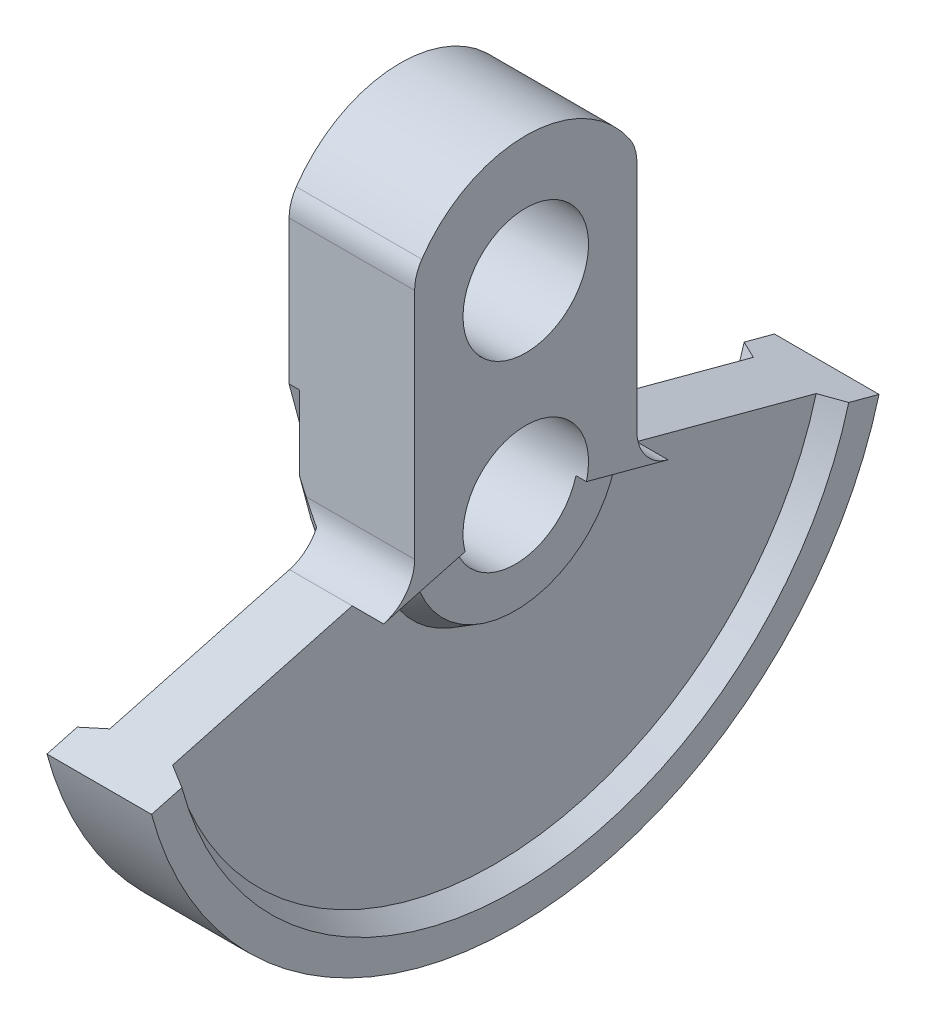
ISO-10303-21;
HEADER;
FILE_DESCRIPTION(('STEP AP214'),'2;1');
FILE_NAME('part.step','',(''),(''),'','','');
FILE_SCHEMA(('AUTOMOTIVE_DESIGN { 1 0 10303 214 1 1 1 1 }'));
ENDSEC;
DATA;
#1=APPLICATION_CONTEXT('core data for automotive mechanical design processes');
#2=APPLICATION_PROTOCOL_DEFINITION('international standard','automotive_design',2000,#1);
#3=PRODUCT_CONTEXT('',#1,'mechanical');
#4=PRODUCT('Part','Part','',(#3));
#5=PRODUCT_RELATED_PRODUCT_CATEGORY('part','',(#4));
#6=PRODUCT_DEFINITION_FORMATION('','',#4);
#7=PRODUCT_DEFINITION_CONTEXT('part definition',#1,'design');
#8=PRODUCT_DEFINITION('design','',#6,#7);
#9=PRODUCT_DEFINITION_SHAPE('','',#8);
#10=(LENGTH_UNIT() NAMED_UNIT(*) SI_UNIT(.MILLI.,.METRE.));
#11=(NAMED_UNIT(*) PLANE_ANGLE_UNIT() SI_UNIT($,.RADIAN.));
#12=(NAMED_UNIT(*) SI_UNIT($,.STERADIAN.) SOLID_ANGLE_UNIT());
#13=UNCERTAINTY_MEASURE_WITH_UNIT(LENGTH_MEASURE(1.E-05),#10,'distance_accuracy_value','');
#14=(GEOMETRIC_REPRESENTATION_CONTEXT(3) GLOBAL_UNCERTAINTY_ASSIGNED_CONTEXT((#13)) GLOBAL_UNIT_ASSIGNED_CONTEXT((#10,
#11,#12)) REPRESENTATION_CONTEXT('',''));
#15=CARTESIAN_POINT('',(0.,0.,0.));
#16=DIRECTION('',(0.,0.,1.));
#17=DIRECTION('',(1.,0.,0.));
#18=AXIS2_PLACEMENT_3D('',#15,#16,#17);
#19=CARTESIAN_POINT('',(0.,0.,0.));
#20=DIRECTION('',(0.,0.965925826289069,-0.258819045102518));
#21=DIRECTION('',(-1.,0.,0.));
#22=AXIS2_PLACEMENT_3D('',#19,#20,#21);
#23=PLANE('',#22);
#24=DIRECTION('',(0.,-0.258819045102518,-0.965925826289069));
#25=VECTOR('',#24,1.);
#26=CARTESIAN_POINT('',(-3.,-8.24216999766041,-30.7601971958889));
#27=LINE('',#26,#25);
#28=CARTESIAN_POINT('',(-3.,-3.64140484936813,-13.5899079087697));
#29=VERTEX_POINT('',#28);
#30=CARTESIAN_POINT('',(-3.,-8.24216999766041,-30.7601971958889));
#31=VERTEX_POINT('',#30);
#32=EDGE_CURVE('E310',#29,#31,#27,.T.);
#33=ORIENTED_EDGE('',*,*,#32,.F.);
#34=DIRECTION('',(-1.,0.,0.));
#35=VECTOR('',#34,1.);
#36=CARTESIAN_POINT('',(6.,-3.64140484936812,-13.5899079087697));
#37=LINE('',#36,#35);
#38=CARTESIAN_POINT('',(3.,-3.64140484936813,-13.5899079087697));
#39=VERTEX_POINT('',#38);
#40=EDGE_CURVE('E291',#29,#39,#37,.F.);
#41=ORIENTED_EDGE('',*,*,#40,.T.);
#42=DIRECTION('',(0.,0.258819045102518,0.965925826289069));
#43=VECTOR('',#42,1.);
#44=CARTESIAN_POINT('',(3.,-2.8470094961277,-10.6251840891798));
#45=LINE('',#44,#43);
#46=CARTESIAN_POINT('',(3.,-8.24216999766041,-30.7601971958889));
#47=VERTEX_POINT('',#46);
#48=EDGE_CURVE('E342',#47,#39,#45,.T.);
#49=ORIENTED_EDGE('',*,*,#48,.F.);
#50=DIRECTION('',(-0.86602540378444,0.129409522551258,0.482962913144531));
#51=VECTOR('',#50,1.);
#52=CARTESIAN_POINT('',(3.,-8.24216999766041,-30.7601971958889));
#53=LINE('',#52,#51);
#54=CARTESIAN_POINT('',(5.,-8.54102848838309,-31.8755522675393));
#55=VERTEX_POINT('',#54);
#56=EDGE_CURVE('E338',#55,#47,#53,.T.);
#57=ORIENTED_EDGE('',*,*,#56,.F.);
#58=DIRECTION('',(0.,0.258819045102518,0.965925826289069));
#59=VECTOR('',#58,1.);
#60=CARTESIAN_POINT('',(5.,-8.54102848838309,-31.8755522675393));
#61=LINE('',#60,#59);
#62=CARTESIAN_POINT('',(5.,-9.31748562369064,-34.7733297464065));
#63=VERTEX_POINT('',#62);
#64=EDGE_CURVE('E335',#63,#55,#61,.T.);
#65=ORIENTED_EDGE('',*,*,#64,.F.);
#66=DIRECTION('',(1.,0.,0.));
#67=VECTOR('',#66,1.);
#68=CARTESIAN_POINT('',(5.,-9.31748562369064,-34.7733297464065));
#69=LINE('',#68,#67);
#70=CARTESIAN_POINT('',(-5.,-9.31748562369064,-34.7733297464065));
#71=VERTEX_POINT('',#70);
#72=EDGE_CURVE('E329',#71,#63,#69,.T.);
#73=ORIENTED_EDGE('',*,*,#72,.F.);
#74=DIRECTION('',(0.,-0.258819045102518,-0.965925826289069));
#75=VECTOR('',#74,1.);
#76=CARTESIAN_POINT('',(-5.,-9.31748562369064,-34.7733297464065));
#77=LINE('',#76,#75);
#78=CARTESIAN_POINT('',(-5.,-8.54102848838309,-31.8755522675393));
#79=VERTEX_POINT('',#78);
#80=EDGE_CURVE('E327',#79,#71,#77,.T.);
#81=ORIENTED_EDGE('',*,*,#80,.F.);
#82=DIRECTION('',(-0.86602540378444,-0.129409522551258,-0.482962913144533));
#83=VECTOR('',#82,1.);
#84=CARTESIAN_POINT('',(-5.,-8.54102848838309,-31.8755522675393));
#85=LINE('',#84,#83);
#86=EDGE_CURVE('E316',#31,#79,#85,.T.);
#87=ORIENTED_EDGE('',*,*,#86,.F.);
#88=EDGE_LOOP('',(#33,#41,#49,#57,#65,#73,#81,#87));
#89=FACE_BOUND('',#88,.T.);
#90=ADVANCED_FACE('F39',(#89),#23,.T.);
#91=CARTESIAN_POINT('',(0.,0.,0.));
#92=DIRECTION('',(-1.,0.,0.));
#93=DIRECTION('',(0.,0.,1.));
#94=AXIS2_PLACEMENT_3D('',#91,#92,#93);
#95=CYLINDRICAL_SURFACE('',#94,8.);
#96=CARTESIAN_POINT('',(-6.,0.,0.));
#97=DIRECTION('',(-1.,0.,0.));
#98=DIRECTION('',(0.,0.,1.));
#99=AXIS2_PLACEMENT_3D('',#96,#97,#98);
#100=CIRCLE('',#99,8.);
#101=CARTESIAN_POINT('',(-6.,-2.07055236082014,-7.72740661031255));
#102=VERTEX_POINT('',#101);
#103=CARTESIAN_POINT('',(-6.,-2.07055236082015,7.72740661031255));
#104=VERTEX_POINT('',#103);
#105=EDGE_CURVE('E286',#102,#104,#100,.T.);
#106=ORIENTED_EDGE('',*,*,#105,.F.);
#107=DIRECTION('',(1.,0.,0.));
#108=VECTOR('',#107,1.);
#109=CARTESIAN_POINT('',(-5.,-2.07055236082014,-7.72740661031255));
#110=LINE('',#109,#108);
#111=CARTESIAN_POINT('',(-5.,-2.07055236082014,-7.72740661031255));
#112=VERTEX_POINT('',#111);
#113=EDGE_CURVE('E250',#102,#112,#110,.T.);
#114=ORIENTED_EDGE('',*,*,#113,.T.);
#115=CARTESIAN_POINT('',(-5.,0.,0.));
#116=DIRECTION('',(-1.,0.,0.));
#117=DIRECTION('',(0.,0.,1.));
#118=AXIS2_PLACEMENT_3D('',#115,#116,#117);
#119=CIRCLE('',#118,8.);
#120=CARTESIAN_POINT('',(-5.,-2.07055236082015,7.72740661031255));
#121=VERTEX_POINT('',#120);
#122=EDGE_CURVE('E229',#112,#121,#119,.T.);
#123=ORIENTED_EDGE('',*,*,#122,.T.);
#124=DIRECTION('',(1.,0.,0.));
#125=VECTOR('',#124,1.);
#126=CARTESIAN_POINT('',(-5.,-2.07055236082014,7.72740661031255));
#127=LINE('',#126,#125);
#128=EDGE_CURVE('E240',#104,#121,#127,.T.);
#129=ORIENTED_EDGE('',*,*,#128,.F.);
#130=EDGE_LOOP('',(#106,#114,#123,#129));
#131=FACE_BOUND('',#130,.T.);
#132=ADVANCED_FACE('F249',(#131),#95,.T.);
#133=CARTESIAN_POINT('',(-6.,-2.07055236082014,-7.72740661031255));
#134=DIRECTION('',(-1.,0.,0.));
#135=DIRECTION('',(0.,0.,1.));
#136=AXIS2_PLACEMENT_3D('',#133,#134,#135);
#137=PLANE('',#136);
#138=DIRECTION('',(0.,-0.965925826289069,-0.258819045102518));
#139=VECTOR('',#138,1.);
#140=CARTESIAN_POINT('',(-6.,18.2138899912503,13.1626065574654));
#141=LINE('',#140,#139);
#142=CARTESIAN_POINT('',(-6.,8.74410041934107,10.6251840891797));
#143=VERTEX_POINT('',#142);
#144=EDGE_CURVE('E237',#143,#104,#141,.T.);
#145=ORIENTED_EDGE('',*,*,#144,.F.);
#146=DIRECTION('',(0.,1.,0.));
#147=VECTOR('',#146,1.);
#148=CARTESIAN_POINT('',(-6.,0.,10.6251840891797));
#149=LINE('',#148,#147);
#150=CARTESIAN_POINT('',(-6.,22.4840758004833,10.6251840891797));
#151=VERTEX_POINT('',#150);
#152=EDGE_CURVE('E453',#143,#151,#149,.T.);
#153=ORIENTED_EDGE('',*,*,#152,.T.);
#154=CARTESIAN_POINT('',(-6.,22.4840758004831,6.62518408917976));
#155=DIRECTION('',(-1.,0.,0.));
#156=DIRECTION('',(0.,0.,1.));
#157=AXIS2_PLACEMENT_3D('',#154,#155,#156);
#158=CIRCLE('',#157,3.99999999999996);
#159=CARTESIAN_POINT('',(-6.,24.7261137007247,9.93777613376963));
#160=VERTEX_POINT('',#159);
#161=EDGE_CURVE('E455',#160,#151,#158,.F.);
#162=ORIENTED_EDGE('',*,*,#161,.F.);
#163=CARTESIAN_POINT('',(-6.,18.,0.));
#164=DIRECTION('',(-1.,0.,0.));
#165=DIRECTION('',(0.,0.,1.));
#166=AXIS2_PLACEMENT_3D('',#163,#164,#165);
#167=CIRCLE('',#166,11.9999999999999);
#168=CARTESIAN_POINT('',(-6.,24.7261137007247,-9.9377761337697));
#169=VERTEX_POINT('',#168);
#170=EDGE_CURVE('E458',#160,#169,#167,.T.);
#171=ORIENTED_EDGE('',*,*,#170,.T.);
#172=CARTESIAN_POINT('',(-6.,22.4840758004831,-6.62518408917976));
#173=DIRECTION('',(-1.,0.,0.));
#174=DIRECTION('',(0.,0.,1.));
#175=AXIS2_PLACEMENT_3D('',#172,#173,#174);
#176=CIRCLE('',#175,4.00000000000004);
#177=CARTESIAN_POINT('',(-6.,22.4840758004832,-10.6251840891798));
#178=VERTEX_POINT('',#177);
#179=EDGE_CURVE('E424',#178,#169,#176,.F.);
#180=ORIENTED_EDGE('',*,*,#179,.F.);
#181=DIRECTION('',(0.,1.,0.));
#182=VECTOR('',#181,1.);
#183=CARTESIAN_POINT('',(-6.,0.,-10.6251840891798));
#184=LINE('',#183,#182);
#185=CARTESIAN_POINT('',(-6.,7.50575230797311,-10.6251840891798));
#186=VERTEX_POINT('',#185);
#187=EDGE_CURVE('E451',#186,#178,#184,.T.);
#188=ORIENTED_EDGE('',*,*,#187,.F.);
#189=DIRECTION('',(0.,-0.258819045102518,-0.965925826289069));
#190=VECTOR('',#189,1.);
#191=CARTESIAN_POINT('',(-6.,7.58870590207055,-10.3155970613377));
#192=LINE('',#191,#190);
#193=CARTESIAN_POINT('',(-6.,7.58870590207055,-10.3155970613377));
#194=VERTEX_POINT('',#193);
#195=EDGE_CURVE('E510',#194,#186,#192,.T.);
#196=ORIENTED_EDGE('',*,*,#195,.F.);
#197=DIRECTION('',(0.,-0.965925826289069,0.258819045102518));
#198=VECTOR('',#197,1.);
#199=CARTESIAN_POINT('',(-6.,7.58870590207055,-10.3155970613377));
#200=LINE('',#199,#198);
#201=EDGE_CURVE('E412',#194,#102,#200,.T.);
#202=ORIENTED_EDGE('',*,*,#201,.T.);
#203=ORIENTED_EDGE('',*,*,#105,.T.);
#204=EDGE_LOOP('',(#145,#153,#162,#171,#180,#188,#196,#202,#203));
#205=FACE_BOUND('',#204,.T.);
#206=CARTESIAN_POINT('',(-6.,0.,0.));
#207=DIRECTION('',(-1.,0.,0.));
#208=DIRECTION('',(0.,0.,1.));
#209=AXIS2_PLACEMENT_3D('',#206,#207,#208);
#210=CIRCLE('',#209,6.);
#211=CARTESIAN_POINT('',(-6.,0.,6.));
#212=VERTEX_POINT('',#211);
#213=EDGE_CURVE('E283',#212,#212,#210,.T.);
#214=ORIENTED_EDGE('',*,*,#213,.F.);
#215=EDGE_LOOP('',(#214));
#216=FACE_BOUND('',#215,.T.);
#217=CARTESIAN_POINT('',(-6.,18.,0.));
#218=DIRECTION('',(-1.,0.,0.));
#219=DIRECTION('',(0.,0.,1.));
#220=AXIS2_PLACEMENT_3D('',#217,#218,#219);
#221=CIRCLE('',#220,6.);
#222=CARTESIAN_POINT('',(-6.,18.,5.99999999999994));
#223=VERTEX_POINT('',#222);
#224=EDGE_CURVE('E414',#223,#223,#221,.T.);
#225=ORIENTED_EDGE('',*,*,#224,.F.);
#226=EDGE_LOOP('',(#225));
#227=FACE_BOUND('',#226,.T.);
#228=ADVANCED_FACE('F41',(#205,#216,#227),#137,.T.);
#229=CARTESIAN_POINT('',(0.,0.,0.));
#230=DIRECTION('',(-1.,0.,0.));
#231=DIRECTION('',(0.,0.,1.));
#232=AXIS2_PLACEMENT_3D('',#229,#230,#231);
#233=CYLINDRICAL_SURFACE('',#232,6.);
#234=ORIENTED_EDGE('',*,*,#213,.T.);
#235=EDGE_LOOP('',(#234));
#236=FACE_BOUND('',#235,.T.);
#237=CARTESIAN_POINT('',(4.99999999999999,0.,0.));
#238=DIRECTION('',(-1.,0.,0.));
#239=DIRECTION('',(0.,0.,1.));
#240=AXIS2_PLACEMENT_3D('',#237,#238,#239);
#241=CIRCLE('',#240,6.);
#242=CARTESIAN_POINT('',(5.,-1.55291427061511,-5.79555495773441));
#243=VERTEX_POINT('',#242);
#244=CARTESIAN_POINT('',(4.99999999999999,-1.55291427061511,5.79555495773441));
#245=VERTEX_POINT('',#244);
#246=EDGE_CURVE('E281',#243,#245,#241,.T.);
#247=ORIENTED_EDGE('',*,*,#246,.F.);
#248=DIRECTION('',(-1.,0.,0.));
#249=VECTOR('',#248,1.);
#250=CARTESIAN_POINT('',(6.,-1.55291427061511,-5.79555495773441));
#251=LINE('',#250,#249);
#252=CARTESIAN_POINT('',(6.,-1.55291427061511,-5.79555495773441));
#253=VERTEX_POINT('',#252);
#254=EDGE_CURVE('E481',#253,#243,#251,.T.);
#255=ORIENTED_EDGE('',*,*,#254,.F.);
#256=CARTESIAN_POINT('',(6.,0.,0.));
#257=DIRECTION('',(-1.,0.,0.));
#258=DIRECTION('',(0.,0.,1.));
#259=AXIS2_PLACEMENT_3D('',#256,#257,#258);
#260=CIRCLE('',#259,6.);
#261=CARTESIAN_POINT('',(6.,-1.55291427061511,5.79555495773441));
#262=VERTEX_POINT('',#261);
#263=EDGE_CURVE('E433',#262,#253,#260,.T.);
#264=ORIENTED_EDGE('',*,*,#263,.F.);
#265=DIRECTION('',(-1.,0.,0.));
#266=VECTOR('',#265,1.);
#267=CARTESIAN_POINT('',(6.,-1.55291427061511,5.79555495773441));
#268=LINE('',#267,#266);
#269=EDGE_CURVE('E478',#262,#245,#268,.T.);
#270=ORIENTED_EDGE('',*,*,#269,.T.);
#271=EDGE_LOOP('',(#247,#255,#264,#270));
#272=FACE_BOUND('',#271,.T.);
#273=ADVANCED_FACE('F537',(#236,#272),#233,.F.);
#274=CARTESIAN_POINT('',(4.99999999999999,-1.55291427061511,-5.79555495773441));
#275=DIRECTION('',(1.,0.,0.));
#276=DIRECTION('',(0.,0.,-1.));
#277=AXIS2_PLACEMENT_3D('',#274,#275,#276);
#278=PLANE('',#277);
#279=CARTESIAN_POINT('',(5.,0.,0.));
#280=DIRECTION('',(-1.,0.,0.));
#281=DIRECTION('',(0.,0.,1.));
#282=AXIS2_PLACEMENT_3D('',#279,#280,#281);
#283=CIRCLE('',#282,9.84529946162075);
#284=CARTESIAN_POINT('',(5.,-2.54815100540502,-9.50982901752935));
#285=VERTEX_POINT('',#284);
#286=CARTESIAN_POINT('',(5.,-2.54815100540502,9.50982901752935));
#287=VERTEX_POINT('',#286);
#288=EDGE_CURVE('E279',#285,#287,#283,.T.);
#289=ORIENTED_EDGE('',*,*,#288,.F.);
#290=DIRECTION('',(0.,0.258819045102518,0.965925826289069));
#291=VECTOR('',#290,1.);
#292=CARTESIAN_POINT('',(4.99999999999999,-1.55291427061511,-5.79555495773441));
#293=LINE('',#292,#291);
#294=EDGE_CURVE('E252',#285,#243,#293,.T.);
#295=ORIENTED_EDGE('',*,*,#294,.T.);
#296=ORIENTED_EDGE('',*,*,#246,.T.);
#297=DIRECTION('',(0.,0.258819045102518,-0.965925826289069));
#298=VECTOR('',#297,1.);
#299=CARTESIAN_POINT('',(4.99999999999999,-1.55291427061511,5.79555495773441));
#300=LINE('',#299,#298);
#301=EDGE_CURVE('E394',#287,#245,#300,.T.);
#302=ORIENTED_EDGE('',*,*,#301,.F.);
#303=EDGE_LOOP('',(#289,#295,#296,#302));
#304=FACE_BOUND('',#303,.T.);
#305=ADVANCED_FACE('F540',(#304),#278,.T.);
#306=CARTESIAN_POINT('',(3.,0.,0.));
#307=DIRECTION('',(-1.,0.,0.));
#308=DIRECTION('',(0.,0.,1.));
#309=AXIS2_PLACEMENT_3D('',#306,#307,#308);
#310=CONICAL_SURFACE('',#309,11.,0.523598775598297);
#311=CARTESIAN_POINT('',(3.,0.,0.));
#312=DIRECTION('',(-1.,0.,0.));
#313=DIRECTION('',(0.,0.,1.));
#314=AXIS2_PLACEMENT_3D('',#311,#312,#313);
#315=CIRCLE('',#314,11.);
#316=CARTESIAN_POINT('',(3.,-2.8470094961277,-10.6251840891798));
#317=VERTEX_POINT('',#316);
#318=CARTESIAN_POINT('',(3.,-2.8470094961277,10.6251840891798));
#319=VERTEX_POINT('',#318);
#320=EDGE_CURVE('E277',#317,#319,#315,.T.);
#321=ORIENTED_EDGE('',*,*,#320,.F.);
#322=DIRECTION('',(0.86602540378444,0.129409522551259,0.482962913144533));
#323=VECTOR('',#322,1.);
#324=CARTESIAN_POINT('',(5.,-2.54815100540502,-9.50982901752935));
#325=LINE('',#324,#323);
#326=EDGE_CURVE('E258',#317,#285,#325,.T.);
#327=ORIENTED_EDGE('',*,*,#326,.T.);
#328=ORIENTED_EDGE('',*,*,#288,.T.);
#329=DIRECTION('',(0.86602540378444,0.129409522551259,-0.482962913144533));
#330=VECTOR('',#329,1.);
#331=CARTESIAN_POINT('',(5.,-2.54815100540502,9.50982901752935));
#332=LINE('',#331,#330);
#333=EDGE_CURVE('E391',#319,#287,#332,.T.);
#334=ORIENTED_EDGE('',*,*,#333,.F.);
#335=EDGE_LOOP('',(#321,#327,#328,#334));
#336=FACE_BOUND('',#335,.T.);
#337=ADVANCED_FACE('F347',(#336),#310,.T.);
#338=CARTESIAN_POINT('',(3.,-2.8470094961277,-10.6251840891798));
#339=DIRECTION('',(1.,0.,0.));
#340=DIRECTION('',(0.,0.,-1.));
#341=AXIS2_PLACEMENT_3D('',#338,#339,#340);
#342=PLANE('',#341);
#343=CARTESIAN_POINT('',(3.,0.,0.));
#344=DIRECTION('',(-1.,0.,0.));
#345=DIRECTION('',(0.,0.,1.));
#346=AXIS2_PLACEMENT_3D('',#343,#344,#345);
#347=CIRCLE('',#346,31.8452994616208);
#348=CARTESIAN_POINT('',(3.,-8.24216999766041,30.7601971958889));
#349=VERTEX_POINT('',#348);
#350=EDGE_CURVE('E275',#47,#349,#347,.T.);
#351=ORIENTED_EDGE('',*,*,#350,.F.);
#352=ORIENTED_EDGE('',*,*,#48,.T.);
#353=EDGE_CURVE('E341',#39,#317,#45,.T.);
#354=ORIENTED_EDGE('',*,*,#353,.T.);
#355=ORIENTED_EDGE('',*,*,#320,.T.);
#356=DIRECTION('',(0.,0.258819045102518,-0.965925826289069));
#357=VECTOR('',#356,1.);
#358=CARTESIAN_POINT('',(3.,-2.8470094961277,10.6251840891798));
#359=LINE('',#358,#357);
#360=CARTESIAN_POINT('',(3.,-3.64140484936812,13.5899079087697));
#361=VERTEX_POINT('',#360);
#362=EDGE_CURVE('E62',#361,#319,#359,.T.);
#363=ORIENTED_EDGE('',*,*,#362,.F.);
#364=EDGE_CURVE('E389',#349,#361,#359,.T.);
#365=ORIENTED_EDGE('',*,*,#364,.F.);
#366=EDGE_LOOP('',(#351,#352,#354,#355,#363,#365));
#367=FACE_BOUND('',#366,.T.);
#368=ADVANCED_FACE('F354',(#367),#342,.T.);
#369=CARTESIAN_POINT('',(5.,0.,0.));
#370=DIRECTION('',(1.,0.,0.));
#371=DIRECTION('',(0.,0.,-1.));
#372=AXIS2_PLACEMENT_3D('',#369,#370,#371);
#373=CONICAL_SURFACE('',#372,33.,0.523598775598295);
#374=CARTESIAN_POINT('',(5.,0.,0.));
#375=DIRECTION('',(-1.,0.,0.));
#376=DIRECTION('',(0.,0.,1.));
#377=AXIS2_PLACEMENT_3D('',#374,#375,#376);
#378=CIRCLE('',#377,33.);
#379=CARTESIAN_POINT('',(5.00000000000001,-8.54102848838309,31.8755522675393));
#380=VERTEX_POINT('',#379);
#381=EDGE_CURVE('E273',#55,#380,#378,.T.);
#382=ORIENTED_EDGE('',*,*,#381,.F.);
#383=ORIENTED_EDGE('',*,*,#56,.T.);
#384=ORIENTED_EDGE('',*,*,#350,.T.);
#385=DIRECTION('',(-0.86602540378444,0.129409522551258,-0.482962913144531));
#386=VECTOR('',#385,1.);
#387=CARTESIAN_POINT('',(3.,-8.24216999766041,30.7601971958889));
#388=LINE('',#387,#386);
#389=EDGE_CURVE('E362',#380,#349,#388,.T.);
#390=ORIENTED_EDGE('',*,*,#389,.F.);
#391=EDGE_LOOP('',(#382,#383,#384,#390));
#392=FACE_BOUND('',#391,.T.);
#393=ADVANCED_FACE('F359',(#392),#373,.F.);
#394=CARTESIAN_POINT('',(5.,-8.54102848838309,-31.8755522675393));
#395=DIRECTION('',(1.,0.,0.));
#396=DIRECTION('',(0.,0.,-1.));
#397=AXIS2_PLACEMENT_3D('',#394,#395,#396);
#398=PLANE('',#397);
#399=CARTESIAN_POINT('',(5.,0.,0.));
#400=DIRECTION('',(-1.,0.,0.));
#401=DIRECTION('',(0.,0.,1.));
#402=AXIS2_PLACEMENT_3D('',#399,#400,#401);
#403=CIRCLE('',#402,36.);
#404=CARTESIAN_POINT('',(5.,-9.31748562369065,34.7733297464065));
#405=VERTEX_POINT('',#404);
#406=EDGE_CURVE('E271',#63,#405,#403,.T.);
#407=ORIENTED_EDGE('',*,*,#406,.F.);
#408=ORIENTED_EDGE('',*,*,#64,.T.);
#409=ORIENTED_EDGE('',*,*,#381,.T.);
#410=DIRECTION('',(0.,0.258819045102518,-0.965925826289069));
#411=VECTOR('',#410,1.);
#412=CARTESIAN_POINT('',(5.00000000000001,-8.54102848838309,31.8755522675393));
#413=LINE('',#412,#411);
#414=EDGE_CURVE('E367',#405,#380,#413,.T.);
#415=ORIENTED_EDGE('',*,*,#414,.F.);
#416=EDGE_LOOP('',(#407,#408,#409,#415));
#417=FACE_BOUND('',#416,.T.);
#418=ADVANCED_FACE('F366',(#417),#398,.T.);
#419=CARTESIAN_POINT('',(0.,0.,0.));
#420=DIRECTION('',(-1.,0.,0.));
#421=DIRECTION('',(0.,0.,1.));
#422=AXIS2_PLACEMENT_3D('',#419,#420,#421);
#423=CYLINDRICAL_SURFACE('',#422,36.);
#424=CARTESIAN_POINT('',(-5.,0.,0.));
#425=DIRECTION('',(-1.,0.,0.));
#426=DIRECTION('',(0.,0.,1.));
#427=AXIS2_PLACEMENT_3D('',#424,#425,#426);
#428=CIRCLE('',#427,36.);
#429=CARTESIAN_POINT('',(-5.,-9.31748562369065,34.7733297464065));
#430=VERTEX_POINT('',#429);
#431=EDGE_CURVE('E269',#71,#430,#428,.T.);
#432=ORIENTED_EDGE('',*,*,#431,.F.);
#433=ORIENTED_EDGE('',*,*,#72,.T.);
#434=ORIENTED_EDGE('',*,*,#406,.T.);
#435=DIRECTION('',(1.,0.,0.));
#436=VECTOR('',#435,1.);
#437=CARTESIAN_POINT('',(5.,-9.31748562369065,34.7733297464065));
#438=LINE('',#437,#436);
#439=EDGE_CURVE('E372',#430,#405,#438,.T.);
#440=ORIENTED_EDGE('',*,*,#439,.F.);
#441=EDGE_LOOP('',(#432,#433,#434,#440));
#442=FACE_BOUND('',#441,.T.);
#443=ADVANCED_FACE('F371',(#442),#423,.T.);
#444=CARTESIAN_POINT('',(-5.,-9.31748562369064,-34.7733297464065));
#445=DIRECTION('',(-1.,0.,0.));
#446=DIRECTION('',(0.,0.,1.));
#447=AXIS2_PLACEMENT_3D('',#444,#445,#446);
#448=PLANE('',#447);
#449=CARTESIAN_POINT('',(-5.,0.,0.));
#450=DIRECTION('',(-1.,0.,0.));
#451=DIRECTION('',(0.,0.,1.));
#452=AXIS2_PLACEMENT_3D('',#449,#450,#451);
#453=CIRCLE('',#452,33.);
#454=CARTESIAN_POINT('',(-5.,-8.54102848838309,31.8755522675393));
#455=VERTEX_POINT('',#454);
#456=EDGE_CURVE('E267',#79,#455,#453,.T.);
#457=ORIENTED_EDGE('',*,*,#456,.F.);
#458=ORIENTED_EDGE('',*,*,#80,.T.);
#459=ORIENTED_EDGE('',*,*,#431,.T.);
#460=DIRECTION('',(0.,-0.258819045102518,0.965925826289069));
#461=VECTOR('',#460,1.);
#462=CARTESIAN_POINT('',(-5.,-9.31748562369065,34.7733297464065));
#463=LINE('',#462,#461);
#464=EDGE_CURVE('E377',#455,#430,#463,.T.);
#465=ORIENTED_EDGE('',*,*,#464,.F.);
#466=EDGE_LOOP('',(#457,#458,#459,#465));
#467=FACE_BOUND('',#466,.T.);
#468=ADVANCED_FACE('F376',(#467),#448,.T.);
#469=CARTESIAN_POINT('',(-3.,0.,0.));
#470=DIRECTION('',(-1.,0.,0.));
#471=DIRECTION('',(0.,0.,1.));
#472=AXIS2_PLACEMENT_3D('',#469,#470,#471);
#473=CONICAL_SURFACE('',#472,31.8452994616207,0.523598775598294);
#474=CARTESIAN_POINT('',(-3.,0.,0.));
#475=DIRECTION('',(-1.,0.,0.));
#476=DIRECTION('',(0.,0.,1.));
#477=AXIS2_PLACEMENT_3D('',#474,#475,#476);
#478=CIRCLE('',#477,31.8452994616207);
#479=CARTESIAN_POINT('',(-3.,-8.24216999766041,30.7601971958889));
#480=VERTEX_POINT('',#479);
#481=EDGE_CURVE('E264',#31,#480,#478,.T.);
#482=ORIENTED_EDGE('',*,*,#481,.F.);
#483=ORIENTED_EDGE('',*,*,#86,.T.);
#484=ORIENTED_EDGE('',*,*,#456,.T.);
#485=DIRECTION('',(-0.86602540378444,-0.129409522551258,0.482962913144533));
#486=VECTOR('',#485,1.);
#487=CARTESIAN_POINT('',(-5.,-8.54102848838309,31.8755522675393));
#488=LINE('',#487,#486);
#489=EDGE_CURVE('E324',#480,#455,#488,.T.);
#490=ORIENTED_EDGE('',*,*,#489,.F.);
#491=EDGE_LOOP('',(#482,#483,#484,#490));
#492=FACE_BOUND('',#491,.T.);
#493=ADVANCED_FACE('F321',(#492),#473,.F.);
#494=CARTESIAN_POINT('',(-3.,-8.24216999766041,-30.7601971958889));
#495=DIRECTION('',(-1.,0.,0.));
#496=DIRECTION('',(0.,0.,1.));
#497=AXIS2_PLACEMENT_3D('',#494,#495,#496);
#498=PLANE('',#497);
#499=CARTESIAN_POINT('',(-3.,0.,0.));
#500=DIRECTION('',(-1.,0.,0.));
#501=DIRECTION('',(0.,0.,1.));
#502=AXIS2_PLACEMENT_3D('',#499,#500,#501);
#503=CIRCLE('',#502,11.);
#504=CARTESIAN_POINT('',(-3.,-2.8470094961277,-10.6251840891798));
#505=VERTEX_POINT('',#504);
#506=CARTESIAN_POINT('',(-3.,-2.8470094961277,10.6251840891798));
#507=VERTEX_POINT('',#506);
#508=EDGE_CURVE('E255',#505,#507,#503,.T.);
#509=ORIENTED_EDGE('',*,*,#508,.F.);
#510=DIRECTION('',(0.,-0.965925826289069,0.258819045102518));
#511=VECTOR('',#510,1.);
#512=CARTESIAN_POINT('',(-3.,6.81224876676299,-13.2133745402049));
#513=LINE('',#512,#511);
#514=CARTESIAN_POINT('',(-3.,-1.46092922602571,-10.9965831781983));
#515=VERTEX_POINT('',#514);
#516=EDGE_CURVE('E54',#515,#505,#513,.T.);
#517=ORIENTED_EDGE('',*,*,#516,.F.);
#518=CARTESIAN_POINT('',(-3.,0.222298455788153,-14.6251840891798));
#519=DIRECTION('',(1.,0.,0.));
#520=DIRECTION('',(0.,0.,-1.));
#521=AXIS2_PLACEMENT_3D('',#518,#519,#520);
#522=CIRCLE('',#521,3.99999999999999);
#523=EDGE_CURVE('E294',#515,#29,#522,.T.);
#524=ORIENTED_EDGE('',*,*,#523,.T.);
#525=ORIENTED_EDGE('',*,*,#32,.T.);
#526=ORIENTED_EDGE('',*,*,#481,.T.);
#527=DIRECTION('',(0.,-0.258819045102518,0.965925826289069));
#528=VECTOR('',#527,1.);
#529=CARTESIAN_POINT('',(-3.,-8.24216999766041,30.7601971958889));
#530=LINE('',#529,#528);
#531=CARTESIAN_POINT('',(-3.,-3.64140484936813,13.5899079087697));
#532=VERTEX_POINT('',#531);
#533=EDGE_CURVE('E380',#532,#480,#530,.T.);
#534=ORIENTED_EDGE('',*,*,#533,.F.);
#535=CARTESIAN_POINT('',(-3.,0.222298455788153,14.6251840891798));
#536=DIRECTION('',(1.,0.,0.));
#537=DIRECTION('',(0.,0.,-1.));
#538=AXIS2_PLACEMENT_3D('',#535,#536,#537);
#539=CIRCLE('',#538,4.00000000000001);
#540=CARTESIAN_POINT('',(-3.,-1.46092922602571,10.9965831781983));
#541=VERTEX_POINT('',#540);
#542=EDGE_CURVE('E503',#541,#532,#539,.F.);
#543=ORIENTED_EDGE('',*,*,#542,.F.);
#544=DIRECTION('',(0.,-0.965925826289069,-0.258819045102518));
#545=VECTOR('',#544,1.);
#546=CARTESIAN_POINT('',(-3.,17.4374328559428,16.0603840363326));
#547=LINE('',#546,#545);
#548=EDGE_CURVE('E489',#541,#507,#547,.T.);
#549=ORIENTED_EDGE('',*,*,#548,.T.);
#550=EDGE_LOOP('',(#509,#517,#524,#525,#526,#534,#543,#549));
#551=FACE_BOUND('',#550,.T.);
#552=ADVANCED_FACE('F309',(#551),#498,.T.);
#553=CARTESIAN_POINT('',(-5.,0.,0.));
#554=DIRECTION('',(1.,0.,0.));
#555=DIRECTION('',(0.,0.,-1.));
#556=AXIS2_PLACEMENT_3D('',#553,#554,#555);
#557=CONICAL_SURFACE('',#556,9.84529946162076,0.523598775598295);
#558=CARTESIAN_POINT('',(-5.,0.,0.));
#559=DIRECTION('',(-1.,0.,0.));
#560=DIRECTION('',(0.,0.,1.));
#561=AXIS2_PLACEMENT_3D('',#558,#559,#560);
#562=CIRCLE('',#561,9.84529946162076);
#563=CARTESIAN_POINT('',(-5.,-2.54815100540502,-9.50982901752936));
#564=VERTEX_POINT('',#563);
#565=CARTESIAN_POINT('',(-5.,-2.54815100540502,9.50982901752936));
#566=VERTEX_POINT('',#565);
#567=EDGE_CURVE('E251',#564,#566,#562,.T.);
#568=ORIENTED_EDGE('',*,*,#567,.F.);
#569=DIRECTION('',(0.86602540378444,-0.129409522551258,-0.482962913144532));
#570=VECTOR('',#569,1.);
#571=CARTESIAN_POINT('',(-3.,-2.8470094961277,-10.6251840891798));
#572=LINE('',#571,#570);
#573=EDGE_CURVE('E317',#564,#505,#572,.T.);
#574=ORIENTED_EDGE('',*,*,#573,.T.);
#575=ORIENTED_EDGE('',*,*,#508,.T.);
#576=DIRECTION('',(0.86602540378444,-0.129409522551258,0.482962913144532));
#577=VECTOR('',#576,1.);
#578=CARTESIAN_POINT('',(-3.,-2.8470094961277,10.6251840891798));
#579=LINE('',#578,#577);
#580=EDGE_CURVE('E246',#566,#507,#579,.T.);
#581=ORIENTED_EDGE('',*,*,#580,.F.);
#582=EDGE_LOOP('',(#568,#574,#575,#581));
#583=FACE_BOUND('',#582,.T.);
#584=ADVANCED_FACE('F400',(#583),#557,.T.);
#585=CARTESIAN_POINT('',(-5.,-2.54815100540502,-9.50982901752936));
#586=DIRECTION('',(-1.,0.,0.));
#587=DIRECTION('',(0.,0.,1.));
#588=AXIS2_PLACEMENT_3D('',#585,#586,#587);
#589=PLANE('',#588);
#590=ORIENTED_EDGE('',*,*,#122,.F.);
#591=DIRECTION('',(0.,-0.965925826289069,0.258819045102518));
#592=VECTOR('',#591,1.);
#593=CARTESIAN_POINT('',(-5.,7.58870590207055,-10.3155970613377));
#594=LINE('',#593,#592);
#595=CARTESIAN_POINT('',(-5.,7.58870590207055,-10.3155970613377));
#596=VERTEX_POINT('',#595);
#597=EDGE_CURVE('E403',#596,#112,#594,.T.);
#598=ORIENTED_EDGE('',*,*,#597,.F.);
#599=DIRECTION('',(0.,0.258819045102518,0.965925826289069));
#600=VECTOR('',#599,1.);
#601=CARTESIAN_POINT('',(-5.,7.11110725748567,-12.0980194685545));
#602=LINE('',#601,#600);
#603=CARTESIAN_POINT('',(-5.,7.50575230797311,-10.6251840891798));
#604=VERTEX_POINT('',#603);
#605=EDGE_CURVE('E505',#604,#596,#602,.T.);
#606=ORIENTED_EDGE('',*,*,#605,.F.);
#607=DIRECTION('',(0.,1.,0.));
#608=VECTOR('',#607,1.);
#609=CARTESIAN_POINT('',(-5.,0.,-10.6251840891798));
#610=LINE('',#609,#608);
#611=CARTESIAN_POINT('',(-5.,1.614410790474,-10.6251840891798));
#612=VERTEX_POINT('',#611);
#613=EDGE_CURVE('E409',#612,#604,#610,.T.);
#614=ORIENTED_EDGE('',*,*,#613,.F.);
#615=DIRECTION('',(0.,-0.965925826289069,0.258819045102518));
#616=VECTOR('',#615,1.);
#617=CARTESIAN_POINT('',(-5.,7.11110725748567,-12.0980194685545));
#618=LINE('',#617,#616);
#619=EDGE_CURVE('E402',#612,#564,#618,.T.);
#620=ORIENTED_EDGE('',*,*,#619,.T.);
#621=ORIENTED_EDGE('',*,*,#567,.T.);
#622=DIRECTION('',(0.,-0.965925826289069,-0.258819045102518));
#623=VECTOR('',#622,1.);
#624=CARTESIAN_POINT('',(-5.,17.7362913466654,14.9450289646822));
#625=LINE('',#624,#623);
#626=CARTESIAN_POINT('',(-5.,1.61441079047386,10.6251840891797));
#627=VERTEX_POINT('',#626);
#628=EDGE_CURVE('E236',#627,#566,#625,.T.);
#629=ORIENTED_EDGE('',*,*,#628,.F.);
#630=DIRECTION('',(0.,1.,0.));
#631=VECTOR('',#630,1.);
#632=CARTESIAN_POINT('',(-5.,0.,10.6251840891797));
#633=LINE('',#632,#631);
#634=CARTESIAN_POINT('',(-5.,8.74410041934109,10.6251840891797));
#635=VERTEX_POINT('',#634);
#636=EDGE_CURVE('E233',#627,#635,#633,.T.);
#637=ORIENTED_EDGE('',*,*,#636,.T.);
#638=DIRECTION('',(0.,-0.965925826289069,-0.258819045102518));
#639=VECTOR('',#638,1.);
#640=CARTESIAN_POINT('',(-5.,18.2138899912503,13.1626065574654));
#641=LINE('',#640,#639);
#642=EDGE_CURVE('E224',#635,#121,#641,.T.);
#643=ORIENTED_EDGE('',*,*,#642,.T.);
#644=EDGE_LOOP('',(#590,#598,#606,#614,#620,#621,#629,#637,#643));
#645=FACE_BOUND('',#644,.T.);
#646=ADVANCED_FACE('F226',(#645),#589,.T.);
#647=CARTESIAN_POINT('',(0.,0.,0.));
#648=DIRECTION('',(0.,-0.965925826289069,-0.258819045102518));
#649=DIRECTION('',(-1.,0.,0.));
#650=AXIS2_PLACEMENT_3D('',#647,#648,#649);
#651=PLANE('',#650);
#652=ORIENTED_EDGE('',*,*,#364,.T.);
#653=DIRECTION('',(-1.,0.,0.));
#654=VECTOR('',#653,1.);
#655=CARTESIAN_POINT('',(6.,-3.64140484936813,13.5899079087697));
#656=LINE('',#655,#654);
#657=EDGE_CURVE('E288',#361,#532,#656,.T.);
#658=ORIENTED_EDGE('',*,*,#657,.T.);
#659=ORIENTED_EDGE('',*,*,#533,.T.);
#660=ORIENTED_EDGE('',*,*,#489,.T.);
#661=ORIENTED_EDGE('',*,*,#464,.T.);
#662=ORIENTED_EDGE('',*,*,#439,.T.);
#663=ORIENTED_EDGE('',*,*,#414,.T.);
#664=ORIENTED_EDGE('',*,*,#389,.T.);
#665=EDGE_LOOP('',(#652,#658,#659,#660,#661,#662,#663,#664));
#666=FACE_BOUND('',#665,.T.);
#667=ADVANCED_FACE('F379',(#666),#651,.F.);
#668=CARTESIAN_POINT('',(6.,0.,0.));
#669=DIRECTION('',(0.,0.965925826289069,0.258819045102518));
#670=DIRECTION('',(0.,-0.258819045102518,0.965925826289069));
#671=AXIS2_PLACEMENT_3D('',#668,#669,#670);
#672=PLANE('',#671);
#673=ORIENTED_EDGE('',*,*,#301,.T.);
#674=ORIENTED_EDGE('',*,*,#269,.F.);
#675=DIRECTION('',(0.,0.258819045102518,-0.965925826289069));
#676=VECTOR('',#675,1.);
#677=CARTESIAN_POINT('',(6.,0.,0.));
#678=LINE('',#677,#676);
#679=CARTESIAN_POINT('',(6.,-3.64140484936812,13.5899079087697));
#680=VERTEX_POINT('',#679);
#681=EDGE_CURVE('E435',#680,#262,#678,.T.);
#682=ORIENTED_EDGE('',*,*,#681,.F.);
#683=DIRECTION('',(-1.,0.,0.));
#684=VECTOR('',#683,1.);
#685=CARTESIAN_POINT('',(6.,-3.64140484936812,13.5899079087697));
#686=LINE('',#685,#684);
#687=EDGE_CURVE('E475',#680,#361,#686,.T.);
#688=ORIENTED_EDGE('',*,*,#687,.T.);
#689=ORIENTED_EDGE('',*,*,#362,.T.);
#690=ORIENTED_EDGE('',*,*,#333,.T.);
#691=EDGE_LOOP('',(#673,#674,#682,#688,#689,#690));
#692=FACE_BOUND('',#691,.T.);
#693=ADVANCED_FACE('F542',(#692),#672,.F.);
#694=CARTESIAN_POINT('',(6.,0.,0.));
#695=DIRECTION('',(0.,-0.965925826289069,0.258819045102518));
#696=DIRECTION('',(0.,-0.258819045102518,-0.965925826289069));
#697=AXIS2_PLACEMENT_3D('',#694,#695,#696);
#698=PLANE('',#697);
#699=ORIENTED_EDGE('',*,*,#254,.T.);
#700=ORIENTED_EDGE('',*,*,#294,.F.);
#701=ORIENTED_EDGE('',*,*,#326,.F.);
#702=ORIENTED_EDGE('',*,*,#353,.F.);
#703=DIRECTION('',(-1.,0.,0.));
#704=VECTOR('',#703,1.);
#705=CARTESIAN_POINT('',(6.,-3.64140484936813,-13.5899079087697));
#706=LINE('',#705,#704);
#707=CARTESIAN_POINT('',(6.,-3.64140484936813,-13.5899079087697));
#708=VERTEX_POINT('',#707);
#709=EDGE_CURVE('E483',#708,#39,#706,.T.);
#710=ORIENTED_EDGE('',*,*,#709,.F.);
#711=DIRECTION('',(0.,0.258819045102518,0.965925826289069));
#712=VECTOR('',#711,1.);
#713=CARTESIAN_POINT('',(6.,0.,0.));
#714=LINE('',#713,#712);
#715=EDGE_CURVE('E430',#708,#253,#714,.T.);
#716=ORIENTED_EDGE('',*,*,#715,.T.);
#717=EDGE_LOOP('',(#699,#700,#701,#702,#710,#716));
#718=FACE_BOUND('',#717,.T.);
#719=ADVANCED_FACE('F353',(#718),#698,.T.);
#720=CARTESIAN_POINT('',(6.,0.,-10.6251840891798));
#721=DIRECTION('',(0.,0.,1.));
#722=DIRECTION('',(0.,-1.,0.));
#723=AXIS2_PLACEMENT_3D('',#720,#721,#722);
#724=PLANE('',#723);
#725=DIRECTION('',(-1.,0.,0.));
#726=VECTOR('',#725,1.);
#727=CARTESIAN_POINT('',(6.,0.222298455788164,-10.6251840891798));
#728=LINE('',#727,#726);
#729=CARTESIAN_POINT('',(6.,0.222298455788164,-10.6251840891798));
#730=VERTEX_POINT('',#729);
#731=CARTESIAN_POINT('',(-4.37593311310904,0.222298455788164,-10.6251840891798));
#732=VERTEX_POINT('',#731);
#733=EDGE_CURVE('E411',#730,#732,#728,.T.);
#734=ORIENTED_EDGE('',*,*,#733,.T.);
#735=DIRECTION('',(-0.409064926172227,0.912505280081003,0.));
#736=VECTOR('',#735,1.);
#737=CARTESIAN_POINT('',(-2.55670732785306,-3.83586695633683,-10.6251840891798));
#738=LINE('',#737,#736);
#739=EDGE_CURVE('E302',#732,#612,#738,.T.);
#740=ORIENTED_EDGE('',*,*,#739,.T.);
#741=ORIENTED_EDGE('',*,*,#613,.T.);
#742=DIRECTION('',(1.,0.,0.));
#743=VECTOR('',#742,1.);
#744=CARTESIAN_POINT('',(6.,7.50575230797311,-10.6251840891798));
#745=LINE('',#744,#743);
#746=EDGE_CURVE('E11',#186,#604,#745,.T.);
#747=ORIENTED_EDGE('',*,*,#746,.F.);
#748=ORIENTED_EDGE('',*,*,#187,.T.);
#749=DIRECTION('',(-1.,0.,0.));
#750=VECTOR('',#749,1.);
#751=CARTESIAN_POINT('',(6.,22.4840758004832,-10.6251840891798));
#752=LINE('',#751,#750);
#753=CARTESIAN_POINT('',(6.,22.4840758004832,-10.6251840891798));
#754=VERTEX_POINT('',#753);
#755=EDGE_CURVE('E247',#754,#178,#752,.T.);
#756=ORIENTED_EDGE('',*,*,#755,.F.);
#757=DIRECTION('',(0.,1.,0.));
#758=VECTOR('',#757,1.);
#759=CARTESIAN_POINT('',(6.,0.,-10.6251840891798));
#760=LINE('',#759,#758);
#761=EDGE_CURVE('E423',#730,#754,#760,.T.);
#762=ORIENTED_EDGE('',*,*,#761,.F.);
#763=EDGE_LOOP('',(#734,#740,#741,#747,#748,#756,#762));
#764=FACE_BOUND('',#763,.T.);
#765=ADVANCED_FACE('F407',(#764),#724,.F.);
#766=CARTESIAN_POINT('',(6.,22.4840758004831,-6.62518408917976));
#767=DIRECTION('',(-1.,0.,0.));
#768=DIRECTION('',(0.,0.,1.));
#769=AXIS2_PLACEMENT_3D('',#766,#767,#768);
#770=CYLINDRICAL_SURFACE('',#769,4.00000000000004);
#771=ORIENTED_EDGE('',*,*,#179,.T.);
#772=DIRECTION('',(-1.,0.,0.));
#773=VECTOR('',#772,1.);
#774=CARTESIAN_POINT('',(6.,24.7261137007247,-9.9377761337697));
#775=LINE('',#774,#773);
#776=CARTESIAN_POINT('',(6.,24.7261137007247,-9.9377761337697));
#777=VERTEX_POINT('',#776);
#778=EDGE_CURVE('E465',#777,#169,#775,.T.);
#779=ORIENTED_EDGE('',*,*,#778,.F.);
#780=CARTESIAN_POINT('',(6.,22.4840758004831,-6.62518408917976));
#781=DIRECTION('',(-1.,0.,0.));
#782=DIRECTION('',(0.,0.,1.));
#783=AXIS2_PLACEMENT_3D('',#780,#781,#782);
#784=CIRCLE('',#783,4.00000000000004);
#785=EDGE_CURVE('E447',#754,#777,#784,.F.);
#786=ORIENTED_EDGE('',*,*,#785,.F.);
#787=ORIENTED_EDGE('',*,*,#755,.T.);
#788=EDGE_LOOP('',(#771,#779,#786,#787));
#789=FACE_BOUND('',#788,.T.);
#790=ADVANCED_FACE('F528',(#789),#770,.T.);
#791=CARTESIAN_POINT('',(6.,18.,0.));
#792=DIRECTION('',(-1.,0.,0.));
#793=DIRECTION('',(0.,0.,1.));
#794=AXIS2_PLACEMENT_3D('',#791,#792,#793);
#795=CYLINDRICAL_SURFACE('',#794,11.9999999999999);
#796=ORIENTED_EDGE('',*,*,#170,.F.);
#797=DIRECTION('',(-1.,0.,0.));
#798=VECTOR('',#797,1.);
#799=CARTESIAN_POINT('',(6.,24.7261137007247,9.93777613376963));
#800=LINE('',#799,#798);
#801=CARTESIAN_POINT('',(6.,24.7261137007247,9.93777613376963));
#802=VERTEX_POINT('',#801);
#803=EDGE_CURVE('E467',#802,#160,#800,.T.);
#804=ORIENTED_EDGE('',*,*,#803,.F.);
#805=CARTESIAN_POINT('',(6.,18.,0.));
#806=DIRECTION('',(-1.,0.,0.));
#807=DIRECTION('',(0.,0.,1.));
#808=AXIS2_PLACEMENT_3D('',#805,#806,#807);
#809=CIRCLE('',#808,11.9999999999999);
#810=EDGE_CURVE('E444',#802,#777,#809,.T.);
#811=ORIENTED_EDGE('',*,*,#810,.T.);
#812=ORIENTED_EDGE('',*,*,#778,.T.);
#813=EDGE_LOOP('',(#796,#804,#811,#812));
#814=FACE_BOUND('',#813,.T.);
#815=ADVANCED_FACE('F559',(#814),#795,.T.);
#816=CARTESIAN_POINT('',(6.,22.4840758004831,6.62518408917976));
#817=DIRECTION('',(-1.,0.,0.));
#818=DIRECTION('',(0.,0.,1.));
#819=AXIS2_PLACEMENT_3D('',#816,#817,#818);
#820=CYLINDRICAL_SURFACE('',#819,3.99999999999996);
#821=ORIENTED_EDGE('',*,*,#161,.T.);
#822=DIRECTION('',(-1.,0.,0.));
#823=VECTOR('',#822,1.);
#824=CARTESIAN_POINT('',(6.,22.4840758004833,10.6251840891797));
#825=LINE('',#824,#823);
#826=CARTESIAN_POINT('',(6.,22.4840758004833,10.6251840891797));
#827=VERTEX_POINT('',#826);
#828=EDGE_CURVE('E469',#827,#151,#825,.T.);
#829=ORIENTED_EDGE('',*,*,#828,.F.);
#830=CARTESIAN_POINT('',(6.,22.4840758004831,6.62518408917976));
#831=DIRECTION('',(-1.,0.,0.));
#832=DIRECTION('',(0.,0.,1.));
#833=AXIS2_PLACEMENT_3D('',#830,#831,#832);
#834=CIRCLE('',#833,3.99999999999996);
#835=EDGE_CURVE('E442',#802,#827,#834,.F.);
#836=ORIENTED_EDGE('',*,*,#835,.F.);
#837=ORIENTED_EDGE('',*,*,#803,.T.);
#838=EDGE_LOOP('',(#821,#829,#836,#837));
#839=FACE_BOUND('',#838,.T.);
#840=ADVANCED_FACE('F556',(#839),#820,.T.);
#841=CARTESIAN_POINT('',(6.,0.,10.6251840891797));
#842=DIRECTION('',(0.,0.,1.));
#843=DIRECTION('',(0.,-1.,0.));
#844=AXIS2_PLACEMENT_3D('',#841,#842,#843);
#845=PLANE('',#844);
#846=DIRECTION('',(-0.409064926172235,0.912505280081,0.));
#847=VECTOR('',#846,1.);
#848=CARTESIAN_POINT('',(-2.55670732785304,-3.83586695633684,10.6251840891798));
#849=LINE('',#848,#847);
#850=CARTESIAN_POINT('',(-4.37593311310907,0.222298455788142,10.6251840891797));
#851=VERTEX_POINT('',#850);
#852=EDGE_CURVE('E492',#851,#627,#849,.T.);
#853=ORIENTED_EDGE('',*,*,#852,.F.);
#854=DIRECTION('',(-1.,0.,0.));
#855=VECTOR('',#854,1.);
#856=CARTESIAN_POINT('',(6.,0.222298455788142,10.6251840891797));
#857=LINE('',#856,#855);
#858=CARTESIAN_POINT('',(6.,0.222298455788142,10.6251840891797));
#859=VERTEX_POINT('',#858);
#860=EDGE_CURVE('E472',#859,#851,#857,.T.);
#861=ORIENTED_EDGE('',*,*,#860,.F.);
#862=DIRECTION('',(0.,1.,0.));
#863=VECTOR('',#862,1.);
#864=CARTESIAN_POINT('',(6.,0.,10.6251840891797));
#865=LINE('',#864,#863);
#866=EDGE_CURVE('E439',#859,#827,#865,.T.);
#867=ORIENTED_EDGE('',*,*,#866,.T.);
#868=ORIENTED_EDGE('',*,*,#828,.T.);
#869=ORIENTED_EDGE('',*,*,#152,.F.);
#870=DIRECTION('',(-1.,0.,0.));
#871=VECTOR('',#870,1.);
#872=CARTESIAN_POINT('',(6.00000000000006,8.74410041934101,10.6251840891797));
#873=LINE('',#872,#871);
#874=EDGE_CURVE('E494',#635,#143,#873,.T.);
#875=ORIENTED_EDGE('',*,*,#874,.F.);
#876=ORIENTED_EDGE('',*,*,#636,.F.);
#877=EDGE_LOOP('',(#853,#861,#867,#868,#869,#875,#876));
#878=FACE_BOUND('',#877,.T.);
#879=ADVANCED_FACE('F551',(#878),#845,.T.);
#880=CARTESIAN_POINT('',(6.,0.222298455788153,14.6251840891798));
#881=DIRECTION('',(-1.,0.,0.));
#882=DIRECTION('',(0.,0.,1.));
#883=AXIS2_PLACEMENT_3D('',#880,#881,#882);
#884=CYLINDRICAL_SURFACE('',#883,4.00000000000001);
#885=CARTESIAN_POINT('',(2.31619731679346,0.222298455788153,14.6251840891798));
#886=DIRECTION('',(0.499999999999998,0.224143868042011,-0.83651630373781));
#887=DIRECTION('',(-0.86602540378444,0.129409522551258,-0.482962913144532));
#888=AXIS2_PLACEMENT_3D('',#885,#886,#887);
#889=ELLIPSE('',#888,8.00000000000005,4.00000000000001);
#890=EDGE_CURVE('E500',#851,#541,#889,.F.);
#891=ORIENTED_EDGE('',*,*,#890,.T.);
#892=ORIENTED_EDGE('',*,*,#542,.T.);
#893=ORIENTED_EDGE('',*,*,#657,.F.);
#894=ORIENTED_EDGE('',*,*,#687,.F.);
#895=CARTESIAN_POINT('',(6.,0.222298455788153,14.6251840891798));
#896=DIRECTION('',(-1.,0.,0.));
#897=DIRECTION('',(0.,0.,1.));
#898=AXIS2_PLACEMENT_3D('',#895,#896,#897);
#899=CIRCLE('',#898,4.00000000000001);
#900=EDGE_CURVE('E437',#859,#680,#899,.T.);
#901=ORIENTED_EDGE('',*,*,#900,.F.);
#902=ORIENTED_EDGE('',*,*,#860,.T.);
#903=EDGE_LOOP('',(#891,#892,#893,#894,#901,#902));
#904=FACE_BOUND('',#903,.T.);
#905=ADVANCED_FACE('F548',(#904),#884,.F.);
#906=CARTESIAN_POINT('',(6.,18.,0.));
#907=DIRECTION('',(-1.,0.,0.));
#908=DIRECTION('',(0.,0.,1.));
#909=AXIS2_PLACEMENT_3D('',#906,#907,#908);
#910=CYLINDRICAL_SURFACE('',#909,6.);
#911=CARTESIAN_POINT('',(6.,18.,0.));
#912=DIRECTION('',(-1.,0.,0.));
#913=DIRECTION('',(0.,0.,1.));
#914=AXIS2_PLACEMENT_3D('',#911,#912,#913);
#915=CIRCLE('',#914,6.);
#916=CARTESIAN_POINT('',(6.,18.,5.99999999999994));
#917=VERTEX_POINT('',#916);
#918=EDGE_CURVE('E420',#917,#917,#915,.T.);
#919=ORIENTED_EDGE('',*,*,#918,.F.);
#920=EDGE_LOOP('',(#919));
#921=FACE_BOUND('',#920,.T.);
#922=ORIENTED_EDGE('',*,*,#224,.T.);
#923=EDGE_LOOP('',(#922));
#924=FACE_BOUND('',#923,.T.);
#925=ADVANCED_FACE('F607',(#921,#924),#910,.F.);
#926=CARTESIAN_POINT('',(6.,0.222298455788153,-14.6251840891798));
#927=DIRECTION('',(-1.,0.,0.));
#928=DIRECTION('',(0.,0.,1.));
#929=AXIS2_PLACEMENT_3D('',#926,#927,#928);
#930=CYLINDRICAL_SURFACE('',#929,3.99999999999999);
#931=CARTESIAN_POINT('',(2.31619731679346,0.222298455788153,-14.6251840891798));
#932=DIRECTION('',(0.499999999999997,0.224143868042011,0.83651630373781));
#933=DIRECTION('',(-0.86602540378444,0.129409522551258,0.482962913144532));
#934=AXIS2_PLACEMENT_3D('',#931,#932,#933);
#935=ELLIPSE('',#934,8.00000000000004,3.99999999999999);
#936=EDGE_CURVE('E47',#732,#515,#935,.T.);
#937=ORIENTED_EDGE('',*,*,#936,.F.);
#938=ORIENTED_EDGE('',*,*,#733,.F.);
#939=CARTESIAN_POINT('',(6.,0.222298455788153,-14.6251840891798));
#940=DIRECTION('',(-1.,0.,0.));
#941=DIRECTION('',(0.,0.,1.));
#942=AXIS2_PLACEMENT_3D('',#939,#940,#941);
#943=CIRCLE('',#942,3.99999999999999);
#944=EDGE_CURVE('E427',#730,#708,#943,.F.);
#945=ORIENTED_EDGE('',*,*,#944,.T.);
#946=ORIENTED_EDGE('',*,*,#709,.T.);
#947=ORIENTED_EDGE('',*,*,#40,.F.);
#948=ORIENTED_EDGE('',*,*,#523,.F.);
#949=EDGE_LOOP('',(#937,#938,#945,#946,#947,#948));
#950=FACE_BOUND('',#949,.T.);
#951=ADVANCED_FACE('F306',(#950),#930,.F.);
#952=CARTESIAN_POINT('',(6.,0.,0.));
#953=DIRECTION('',(-1.,0.,0.));
#954=DIRECTION('',(0.,0.,1.));
#955=AXIS2_PLACEMENT_3D('',#952,#953,#954);
#956=PLANE('',#955);
#957=ORIENTED_EDGE('',*,*,#918,.T.);
#958=EDGE_LOOP('',(#957));
#959=FACE_BOUND('',#958,.T.);
#960=ORIENTED_EDGE('',*,*,#761,.T.);
#961=ORIENTED_EDGE('',*,*,#785,.T.);
#962=ORIENTED_EDGE('',*,*,#810,.F.);
#963=ORIENTED_EDGE('',*,*,#835,.T.);
#964=ORIENTED_EDGE('',*,*,#866,.F.);
#965=ORIENTED_EDGE('',*,*,#900,.T.);
#966=ORIENTED_EDGE('',*,*,#681,.T.);
#967=ORIENTED_EDGE('',*,*,#263,.T.);
#968=ORIENTED_EDGE('',*,*,#715,.F.);
#969=ORIENTED_EDGE('',*,*,#944,.F.);
#970=EDGE_LOOP('',(#960,#961,#962,#963,#964,#965,#966,#967,#968,#969));
#971=FACE_BOUND('',#970,.T.);
#972=ADVANCED_FACE('F532',(#959,#971),#956,.F.);
#973=CARTESIAN_POINT('',(0.,9.65925826289069,-2.58819045102518));
#974=DIRECTION('',(0.,-0.965925826289069,0.258819045102518));
#975=DIRECTION('',(0.,-0.258819045102518,-0.965925826289069));
#976=AXIS2_PLACEMENT_3D('',#973,#974,#975);
#977=PLANE('',#976);
#978=ORIENTED_EDGE('',*,*,#746,.T.);
#979=ORIENTED_EDGE('',*,*,#605,.T.);
#980=DIRECTION('',(-1.,0.,0.));
#981=VECTOR('',#980,1.);
#982=CARTESIAN_POINT('',(-5.,7.58870590207055,-10.3155970613377));
#983=LINE('',#982,#981);
#984=EDGE_CURVE('E507',#596,#194,#983,.T.);
#985=ORIENTED_EDGE('',*,*,#984,.T.);
#986=ORIENTED_EDGE('',*,*,#195,.T.);
#987=EDGE_LOOP('',(#978,#979,#985,#986));
#988=FACE_BOUND('',#987,.T.);
#989=ADVANCED_FACE('F517',(#988),#977,.T.);
#990=CARTESIAN_POINT('',(-3.,6.81224876676299,-13.2133745402049));
#991=DIRECTION('',(0.499999999999997,0.224143868042011,0.83651630373781));
#992=DIRECTION('',(0.858356263574051,0.,-0.513054114868203));
#993=AXIS2_PLACEMENT_3D('',#990,#991,#992);
#994=PLANE('',#993);
#995=ORIENTED_EDGE('',*,*,#936,.T.);
#996=ORIENTED_EDGE('',*,*,#516,.T.);
#997=ORIENTED_EDGE('',*,*,#573,.F.);
#998=ORIENTED_EDGE('',*,*,#619,.F.);
#999=ORIENTED_EDGE('',*,*,#739,.F.);
#1000=EDGE_LOOP('',(#995,#996,#997,#998,#999));
#1001=FACE_BOUND('',#1000,.T.);
#1002=ADVANCED_FACE('F298',(#1001),#994,.F.);
#1003=CARTESIAN_POINT('',(-5.,7.58870590207055,-10.3155970613377));
#1004=DIRECTION('',(0.,0.258819045102518,0.965925826289069));
#1005=DIRECTION('',(0.,-0.965925826289069,0.258819045102518));
#1006=AXIS2_PLACEMENT_3D('',#1003,#1004,#1005);
#1007=PLANE('',#1006);
#1008=ORIENTED_EDGE('',*,*,#113,.F.);
#1009=ORIENTED_EDGE('',*,*,#201,.F.);
#1010=ORIENTED_EDGE('',*,*,#984,.F.);
#1011=ORIENTED_EDGE('',*,*,#597,.T.);
#1012=EDGE_LOOP('',(#1008,#1009,#1010,#1011));
#1013=FACE_BOUND('',#1012,.T.);
#1014=ADVANCED_FACE('F514',(#1013),#1007,.F.);
#1015=CARTESIAN_POINT('',(-3.,17.4374328559428,16.0603840363326));
#1016=DIRECTION('',(0.499999999999998,0.224143868042011,-0.83651630373781));
#1017=DIRECTION('',(-0.85835626357405,0.,-0.513054114868203));
#1018=AXIS2_PLACEMENT_3D('',#1015,#1016,#1017);
#1019=PLANE('',#1018);
#1020=ORIENTED_EDGE('',*,*,#852,.T.);
#1021=ORIENTED_EDGE('',*,*,#628,.T.);
#1022=ORIENTED_EDGE('',*,*,#580,.T.);
#1023=ORIENTED_EDGE('',*,*,#548,.F.);
#1024=ORIENTED_EDGE('',*,*,#890,.F.);
#1025=EDGE_LOOP('',(#1020,#1021,#1022,#1023,#1024));
#1026=FACE_BOUND('',#1025,.T.);
#1027=ADVANCED_FACE('F488',(#1026),#1019,.F.);
#1028=CARTESIAN_POINT('',(-5.,18.2138899912503,13.1626065574654));
#1029=DIRECTION('',(0.,0.258819045102518,-0.965925826289069));
#1030=DIRECTION('',(0.,0.965925826289069,0.258819045102518));
#1031=AXIS2_PLACEMENT_3D('',#1028,#1029,#1030);
#1032=PLANE('',#1031);
#1033=ORIENTED_EDGE('',*,*,#874,.T.);
#1034=ORIENTED_EDGE('',*,*,#144,.T.);
#1035=ORIENTED_EDGE('',*,*,#128,.T.);
#1036=ORIENTED_EDGE('',*,*,#642,.F.);
#1037=EDGE_LOOP('',(#1033,#1034,#1035,#1036));
#1038=FACE_BOUND('',#1037,.T.);
#1039=ADVANCED_FACE('F241',(#1038),#1032,.F.);
#1040=CLOSED_SHELL('',(#90,#132,#228,#273,#305,#337,#368,#393,#418,#443,#468,#493,#552,#584,
#646,#667,#693,#719,#765,#790,#815,#840,#879,#905,#925,#951,#972,#989,#1002,#1014,#1027,#1039));
#1041=MANIFOLD_SOLID_BREP('B2',#1040);
#1042=ADVANCED_BREP_SHAPE_REPRESENTATION('',(#18,#1041),#14);
#1043=SHAPE_DEFINITION_REPRESENTATION(#9,#1042);
ENDSEC;
END-ISO-10303-21;
